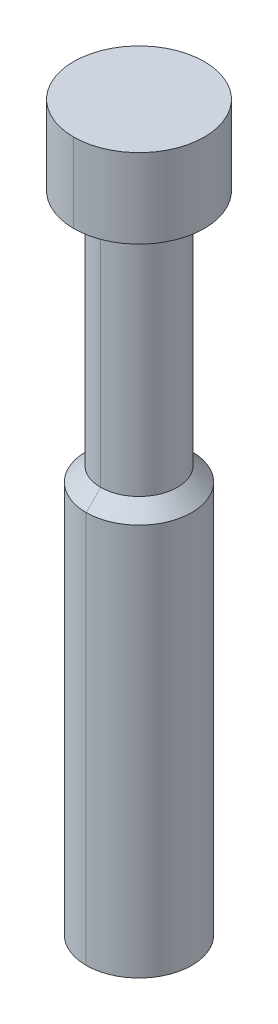
ISO-10303-21;
HEADER;
FILE_DESCRIPTION(('STEP AP214'),'2;1');
FILE_NAME('part.step','',(''),(''),'','','');
FILE_SCHEMA(('AUTOMOTIVE_DESIGN { 1 0 10303 214 1 1 1 1 }'));
ENDSEC;
DATA;
#1=APPLICATION_CONTEXT('core data for automotive mechanical design processes');
#2=APPLICATION_PROTOCOL_DEFINITION('international standard','automotive_design',2000,#1);
#3=PRODUCT_CONTEXT('',#1,'mechanical');
#4=PRODUCT('Part','Part','',(#3));
#5=PRODUCT_RELATED_PRODUCT_CATEGORY('part','',(#4));
#6=PRODUCT_DEFINITION_FORMATION('','',#4);
#7=PRODUCT_DEFINITION_CONTEXT('part definition',#1,'design');
#8=PRODUCT_DEFINITION('design','',#6,#7);
#9=PRODUCT_DEFINITION_SHAPE('','',#8);
#10=(LENGTH_UNIT() NAMED_UNIT(*) SI_UNIT(.MILLI.,.METRE.));
#11=(NAMED_UNIT(*) PLANE_ANGLE_UNIT() SI_UNIT($,.RADIAN.));
#12=(NAMED_UNIT(*) SI_UNIT($,.STERADIAN.) SOLID_ANGLE_UNIT());
#13=UNCERTAINTY_MEASURE_WITH_UNIT(LENGTH_MEASURE(1.E-05),#10,'distance_accuracy_value','');
#14=(GEOMETRIC_REPRESENTATION_CONTEXT(3) GLOBAL_UNCERTAINTY_ASSIGNED_CONTEXT((#13)) GLOBAL_UNIT_ASSIGNED_CONTEXT((#10,
#11,#12)) REPRESENTATION_CONTEXT('',''));
#15=CARTESIAN_POINT('',(0.,0.,0.));
#16=DIRECTION('',(0.,0.,1.));
#17=DIRECTION('',(1.,0.,0.));
#18=AXIS2_PLACEMENT_3D('',#15,#16,#17);
#19=CARTESIAN_POINT('',(0.,0.,0.));
#20=DIRECTION('',(0.,-1.,0.));
#21=DIRECTION('',(0.,0.,-1.));
#22=AXIS2_PLACEMENT_3D('',#19,#20,#21);
#23=CONICAL_SURFACE('',#22,1.45,0.785398163397449);
#24=DIRECTION('',(0.,-0.707106781186547,0.707106781186548));
#25=VECTOR('',#24,1.);
#26=CARTESIAN_POINT('',(0.,0.,1.45));
#27=LINE('',#26,#25);
#28=CARTESIAN_POINT('',(0.,0.,1.45));
#29=VERTEX_POINT('',#28);
#30=CARTESIAN_POINT('',(0.,-0.549999999999993,2.));
#31=VERTEX_POINT('',#30);
#32=EDGE_CURVE('E112',#29,#31,#27,.T.);
#33=ORIENTED_EDGE('',*,*,#32,.F.);
#34=CARTESIAN_POINT('',(0.,0.,0.));
#35=DIRECTION('',(0.,1.,0.));
#36=DIRECTION('',(0.,0.,1.));
#37=AXIS2_PLACEMENT_3D('',#34,#35,#36);
#38=CIRCLE('',#37,1.45);
#39=CARTESIAN_POINT('',(0.,0.,-1.45));
#40=VERTEX_POINT('',#39);
#41=EDGE_CURVE('E87',#40,#29,#38,.T.);
#42=ORIENTED_EDGE('',*,*,#41,.F.);
#43=DIRECTION('',(0.,-0.707106781186547,-0.707106781186548));
#44=VECTOR('',#43,1.);
#45=CARTESIAN_POINT('',(0.,0.,-1.45));
#46=LINE('',#45,#44);
#47=CARTESIAN_POINT('',(0.,-0.549999999999993,-2.));
#48=VERTEX_POINT('',#47);
#49=EDGE_CURVE('E118',#40,#48,#46,.T.);
#50=ORIENTED_EDGE('',*,*,#49,.T.);
#51=CARTESIAN_POINT('',(0.,-0.549999999999993,0.));
#52=DIRECTION('',(0.,-1.,0.));
#53=DIRECTION('',(0.,0.,1.));
#54=AXIS2_PLACEMENT_3D('',#51,#52,#53);
#55=CIRCLE('',#54,2.);
#56=EDGE_CURVE('E115',#31,#48,#55,.T.);
#57=ORIENTED_EDGE('',*,*,#56,.F.);
#58=EDGE_LOOP('',(#33,#42,#50,#57));
#59=FACE_BOUND('',#58,.T.);
#60=ADVANCED_FACE('F15',(#59),#23,.T.);
#61=CARTESIAN_POINT('',(0.,9.,0.));
#62=DIRECTION('',(0.,1.,0.));
#63=DIRECTION('',(1.,0.,0.));
#64=AXIS2_PLACEMENT_3D('',#61,#62,#63);
#65=PLANE('',#64);
#66=CARTESIAN_POINT('',(0.,9.,0.));
#67=DIRECTION('',(0.,1.,0.));
#68=DIRECTION('',(0.,0.,1.));
#69=AXIS2_PLACEMENT_3D('',#66,#67,#68);
#70=CIRCLE('',#69,1.45);
#71=CARTESIAN_POINT('',(0.,9.,-1.45));
#72=VERTEX_POINT('',#71);
#73=CARTESIAN_POINT('',(0.,9.,1.45));
#74=VERTEX_POINT('',#73);
#75=EDGE_CURVE('E97',#72,#74,#70,.T.);
#76=ORIENTED_EDGE('',*,*,#75,.T.);
#77=CARTESIAN_POINT('',(0.,9.,0.));
#78=DIRECTION('',(0.,1.,0.));
#79=DIRECTION('',(0.,0.,1.));
#80=AXIS2_PLACEMENT_3D('',#77,#78,#79);
#81=CIRCLE('',#80,1.45);
#82=EDGE_CURVE('E110',#74,#72,#81,.T.);
#83=ORIENTED_EDGE('',*,*,#82,.T.);
#84=EDGE_LOOP('',(#76,#83));
#85=FACE_BOUND('',#84,.T.);
#86=CARTESIAN_POINT('',(0.,9.,0.));
#87=DIRECTION('',(0.,1.,0.));
#88=DIRECTION('',(0.,0.,1.));
#89=AXIS2_PLACEMENT_3D('',#86,#87,#88);
#90=CIRCLE('',#89,2.475);
#91=CARTESIAN_POINT('',(0.,9.,-2.475));
#92=VERTEX_POINT('',#91);
#93=CARTESIAN_POINT('',(0.,9.,2.475));
#94=VERTEX_POINT('',#93);
#95=EDGE_CURVE('E9',#92,#94,#90,.T.);
#96=ORIENTED_EDGE('',*,*,#95,.F.);
#97=CARTESIAN_POINT('',(0.,9.,0.));
#98=DIRECTION('',(0.,1.,0.));
#99=DIRECTION('',(0.,0.,1.));
#100=AXIS2_PLACEMENT_3D('',#97,#98,#99);
#101=CIRCLE('',#100,2.475);
#102=EDGE_CURVE('E151',#94,#92,#101,.T.);
#103=ORIENTED_EDGE('',*,*,#102,.F.);
#104=EDGE_LOOP('',(#96,#103));
#105=FACE_BOUND('',#104,.T.);
#106=ADVANCED_FACE('F177',(#85,#105),#65,.F.);
#107=CARTESIAN_POINT('',(0.,12.,0.));
#108=DIRECTION('',(0.,1.,0.));
#109=DIRECTION('',(1.,0.,0.));
#110=AXIS2_PLACEMENT_3D('',#107,#108,#109);
#111=PLANE('',#110);
#112=CARTESIAN_POINT('',(0.,12.,0.));
#113=DIRECTION('',(0.,1.,0.));
#114=DIRECTION('',(0.,0.,1.));
#115=AXIS2_PLACEMENT_3D('',#112,#113,#114);
#116=CIRCLE('',#115,2.475);
#117=CARTESIAN_POINT('',(0.,12.,-2.475));
#118=VERTEX_POINT('',#117);
#119=CARTESIAN_POINT('',(0.,12.,2.475));
#120=VERTEX_POINT('',#119);
#121=EDGE_CURVE('E23',#118,#120,#116,.T.);
#122=ORIENTED_EDGE('',*,*,#121,.T.);
#123=CARTESIAN_POINT('',(0.,12.,0.));
#124=DIRECTION('',(0.,1.,0.));
#125=DIRECTION('',(0.,0.,1.));
#126=AXIS2_PLACEMENT_3D('',#123,#124,#125);
#127=CIRCLE('',#126,2.475);
#128=EDGE_CURVE('E143',#120,#118,#127,.T.);
#129=ORIENTED_EDGE('',*,*,#128,.T.);
#130=EDGE_LOOP('',(#122,#129));
#131=FACE_BOUND('',#130,.T.);
#132=ADVANCED_FACE('F171',(#131),#111,.T.);
#133=CARTESIAN_POINT('',(0.,12.,0.));
#134=DIRECTION('',(0.,-1.,0.));
#135=DIRECTION('',(0.,0.,-1.));
#136=AXIS2_PLACEMENT_3D('',#133,#134,#135);
#137=CYLINDRICAL_SURFACE('',#136,2.475);
#138=DIRECTION('',(0.,-1.,0.));
#139=VECTOR('',#138,1.);
#140=CARTESIAN_POINT('',(0.,12.,2.475));
#141=LINE('',#140,#139);
#142=EDGE_CURVE('E144',#120,#94,#141,.T.);
#143=ORIENTED_EDGE('',*,*,#142,.F.);
#144=ORIENTED_EDGE('',*,*,#121,.F.);
#145=DIRECTION('',(0.,-1.,0.));
#146=VECTOR('',#145,1.);
#147=CARTESIAN_POINT('',(0.,12.,-2.475));
#148=LINE('',#147,#146);
#149=EDGE_CURVE('E139',#118,#92,#148,.T.);
#150=ORIENTED_EDGE('',*,*,#149,.T.);
#151=ORIENTED_EDGE('',*,*,#95,.T.);
#152=EDGE_LOOP('',(#143,#144,#150,#151));
#153=FACE_BOUND('',#152,.T.);
#154=ADVANCED_FACE('F175',(#153),#137,.T.);
#155=CARTESIAN_POINT('',(0.,9.,0.));
#156=DIRECTION('',(0.,-1.,0.));
#157=DIRECTION('',(0.,0.,-1.));
#158=AXIS2_PLACEMENT_3D('',#155,#156,#157);
#159=CYLINDRICAL_SURFACE('',#158,1.45);
#160=DIRECTION('',(0.,-1.,0.));
#161=VECTOR('',#160,1.);
#162=CARTESIAN_POINT('',(0.,9.,1.45));
#163=LINE('',#162,#161);
#164=EDGE_CURVE('E89',#74,#29,#163,.T.);
#165=ORIENTED_EDGE('',*,*,#164,.F.);
#166=ORIENTED_EDGE('',*,*,#75,.F.);
#167=DIRECTION('',(0.,-1.,0.));
#168=VECTOR('',#167,1.);
#169=CARTESIAN_POINT('',(0.,9.,-1.45));
#170=LINE('',#169,#168);
#171=EDGE_CURVE('E91',#72,#40,#170,.T.);
#172=ORIENTED_EDGE('',*,*,#171,.T.);
#173=ORIENTED_EDGE('',*,*,#41,.T.);
#174=EDGE_LOOP('',(#165,#166,#172,#173));
#175=FACE_BOUND('',#174,.T.);
#176=ADVANCED_FACE('F90',(#175),#159,.T.);
#177=CARTESIAN_POINT('',(0.,-15.4,0.));
#178=DIRECTION('',(0.,1.,0.));
#179=DIRECTION('',(1.,0.,0.));
#180=AXIS2_PLACEMENT_3D('',#177,#178,#179);
#181=PLANE('',#180);
#182=CARTESIAN_POINT('',(0.,-15.4,0.));
#183=DIRECTION('',(0.,1.,0.));
#184=DIRECTION('',(0.,0.,1.));
#185=AXIS2_PLACEMENT_3D('',#182,#183,#184);
#186=CIRCLE('',#185,2.);
#187=CARTESIAN_POINT('',(0.,-15.4,2.));
#188=VERTEX_POINT('',#187);
#189=CARTESIAN_POINT('',(0.,-15.4,-2.));
#190=VERTEX_POINT('',#189);
#191=EDGE_CURVE('E134',#188,#190,#186,.T.);
#192=ORIENTED_EDGE('',*,*,#191,.F.);
#193=CARTESIAN_POINT('',(0.,-15.4,0.));
#194=DIRECTION('',(0.,1.,0.));
#195=DIRECTION('',(0.,0.,1.));
#196=AXIS2_PLACEMENT_3D('',#193,#194,#195);
#197=CIRCLE('',#196,2.);
#198=EDGE_CURVE('E34',#190,#188,#197,.T.);
#199=ORIENTED_EDGE('',*,*,#198,.F.);
#200=EDGE_LOOP('',(#192,#199));
#201=FACE_BOUND('',#200,.T.);
#202=ADVANCED_FACE('F191',(#201),#181,.F.);
#203=CARTESIAN_POINT('',(0.,-15.4,0.));
#204=DIRECTION('',(0.,1.,0.));
#205=DIRECTION('',(0.,0.,1.));
#206=AXIS2_PLACEMENT_3D('',#203,#204,#205);
#207=CYLINDRICAL_SURFACE('',#206,2.);
#208=DIRECTION('',(0.,1.,0.));
#209=VECTOR('',#208,1.);
#210=CARTESIAN_POINT('',(0.,-15.4,-2.));
#211=LINE('',#210,#209);
#212=EDGE_CURVE('E131',#190,#48,#211,.T.);
#213=ORIENTED_EDGE('',*,*,#212,.F.);
#214=ORIENTED_EDGE('',*,*,#198,.T.);
#215=DIRECTION('',(0.,1.,0.));
#216=VECTOR('',#215,1.);
#217=CARTESIAN_POINT('',(0.,-15.4,2.));
#218=LINE('',#217,#216);
#219=EDGE_CURVE('E130',#188,#31,#218,.T.);
#220=ORIENTED_EDGE('',*,*,#219,.T.);
#221=ORIENTED_EDGE('',*,*,#56,.T.);
#222=EDGE_LOOP('',(#213,#214,#220,#221));
#223=FACE_BOUND('',#222,.T.);
#224=ADVANCED_FACE('F197',(#223),#207,.T.);
#225=CARTESIAN_POINT('',(0.,-15.4,0.));
#226=DIRECTION('',(0.,1.,0.));
#227=DIRECTION('',(0.,0.,1.));
#228=AXIS2_PLACEMENT_3D('',#225,#226,#227);
#229=CYLINDRICAL_SURFACE('',#228,2.);
#230=ORIENTED_EDGE('',*,*,#191,.T.);
#231=ORIENTED_EDGE('',*,*,#212,.T.);
#232=CARTESIAN_POINT('',(0.,-0.549999999999993,0.));
#233=DIRECTION('',(0.,-1.,0.));
#234=DIRECTION('',(0.,0.,1.));
#235=AXIS2_PLACEMENT_3D('',#232,#233,#234);
#236=CIRCLE('',#235,2.);
#237=EDGE_CURVE('E116',#48,#31,#236,.T.);
#238=ORIENTED_EDGE('',*,*,#237,.T.);
#239=ORIENTED_EDGE('',*,*,#219,.F.);
#240=EDGE_LOOP('',(#230,#231,#238,#239));
#241=FACE_BOUND('',#240,.T.);
#242=ADVANCED_FACE('F199',(#241),#229,.T.);
#243=CARTESIAN_POINT('',(0.,9.,0.));
#244=DIRECTION('',(0.,-1.,0.));
#245=DIRECTION('',(0.,0.,-1.));
#246=AXIS2_PLACEMENT_3D('',#243,#244,#245);
#247=CYLINDRICAL_SURFACE('',#246,1.45);
#248=ORIENTED_EDGE('',*,*,#82,.F.);
#249=ORIENTED_EDGE('',*,*,#164,.T.);
#250=CARTESIAN_POINT('',(0.,0.,0.));
#251=DIRECTION('',(0.,1.,0.));
#252=DIRECTION('',(0.,0.,1.));
#253=AXIS2_PLACEMENT_3D('',#250,#251,#252);
#254=CIRCLE('',#253,1.45);
#255=EDGE_CURVE('E104',#29,#40,#254,.T.);
#256=ORIENTED_EDGE('',*,*,#255,.T.);
#257=ORIENTED_EDGE('',*,*,#171,.F.);
#258=EDGE_LOOP('',(#248,#249,#256,#257));
#259=FACE_BOUND('',#258,.T.);
#260=ADVANCED_FACE('F103',(#259),#247,.T.);
#261=CARTESIAN_POINT('',(0.,12.,0.));
#262=DIRECTION('',(0.,-1.,0.));
#263=DIRECTION('',(0.,0.,-1.));
#264=AXIS2_PLACEMENT_3D('',#261,#262,#263);
#265=CYLINDRICAL_SURFACE('',#264,2.475);
#266=ORIENTED_EDGE('',*,*,#128,.F.);
#267=ORIENTED_EDGE('',*,*,#142,.T.);
#268=ORIENTED_EDGE('',*,*,#102,.T.);
#269=ORIENTED_EDGE('',*,*,#149,.F.);
#270=EDGE_LOOP('',(#266,#267,#268,#269));
#271=FACE_BOUND('',#270,.T.);
#272=ADVANCED_FACE('F180',(#271),#265,.T.);
#273=CARTESIAN_POINT('',(0.,0.,0.));
#274=DIRECTION('',(0.,-1.,0.));
#275=DIRECTION('',(0.,0.,-1.));
#276=AXIS2_PLACEMENT_3D('',#273,#274,#275);
#277=CONICAL_SURFACE('',#276,1.45,0.785398163397449);
#278=ORIENTED_EDGE('',*,*,#255,.F.);
#279=ORIENTED_EDGE('',*,*,#32,.T.);
#280=ORIENTED_EDGE('',*,*,#237,.F.);
#281=ORIENTED_EDGE('',*,*,#49,.F.);
#282=EDGE_LOOP('',(#278,#279,#280,#281));
#283=FACE_BOUND('',#282,.T.);
#284=ADVANCED_FACE('F119',(#283),#277,.T.);
#285=CLOSED_SHELL('',(#60,#106,#132,#154,#176,#202,#224,#242,#260,#272,#284));
#286=MANIFOLD_SOLID_BREP('B1',#285);
#287=ADVANCED_BREP_SHAPE_REPRESENTATION('',(#18,#286),#14);
#288=SHAPE_DEFINITION_REPRESENTATION(#9,#287);
ENDSEC;
END-ISO-10303-21;
